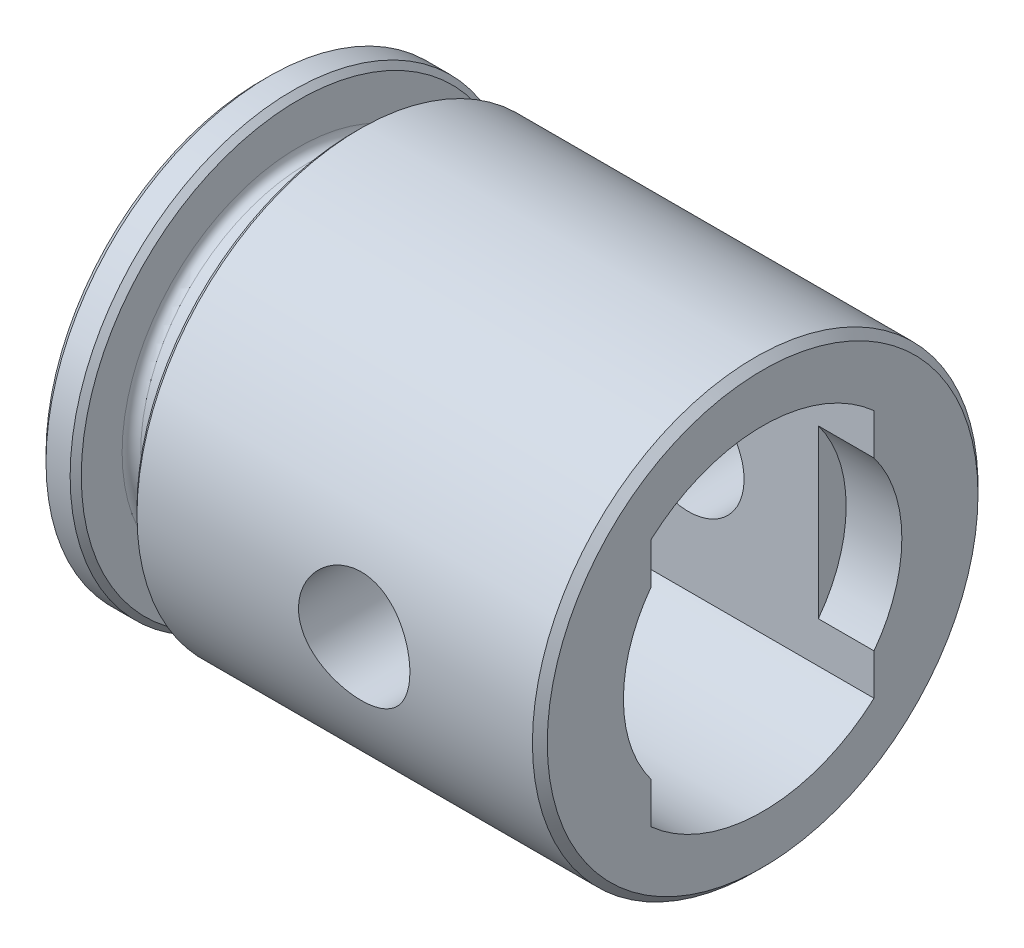
ISO-10303-21;
HEADER;
FILE_DESCRIPTION(('STEP AP214'),'2;1');
FILE_NAME('part.step','',(''),(''),'','','');
FILE_SCHEMA(('AUTOMOTIVE_DESIGN { 1 0 10303 214 1 1 1 1 }'));
ENDSEC;
DATA;
#1=APPLICATION_CONTEXT('core data for automotive mechanical design processes');
#2=APPLICATION_PROTOCOL_DEFINITION('international standard','automotive_design',2000,#1);
#3=PRODUCT_CONTEXT('',#1,'mechanical');
#4=PRODUCT('Part','Part','',(#3));
#5=PRODUCT_RELATED_PRODUCT_CATEGORY('part','',(#4));
#6=PRODUCT_DEFINITION_FORMATION('','',#4);
#7=PRODUCT_DEFINITION_CONTEXT('part definition',#1,'design');
#8=PRODUCT_DEFINITION('design','',#6,#7);
#9=PRODUCT_DEFINITION_SHAPE('','',#8);
#10=(LENGTH_UNIT() NAMED_UNIT(*) SI_UNIT(.MILLI.,.METRE.));
#11=(NAMED_UNIT(*) PLANE_ANGLE_UNIT() SI_UNIT($,.RADIAN.));
#12=(NAMED_UNIT(*) SI_UNIT($,.STERADIAN.) SOLID_ANGLE_UNIT());
#13=UNCERTAINTY_MEASURE_WITH_UNIT(LENGTH_MEASURE(1.E-05),#10,'distance_accuracy_value','');
#14=(GEOMETRIC_REPRESENTATION_CONTEXT(3) GLOBAL_UNCERTAINTY_ASSIGNED_CONTEXT((#13)) GLOBAL_UNIT_ASSIGNED_CONTEXT((#10,
#11,#12)) REPRESENTATION_CONTEXT('',''));
#15=CARTESIAN_POINT('',(0.,0.,0.));
#16=DIRECTION('',(0.,0.,1.));
#17=DIRECTION('',(1.,0.,0.));
#18=AXIS2_PLACEMENT_3D('',#15,#16,#17);
#19=CARTESIAN_POINT('',(-23.48992,0.,0.));
#20=DIRECTION('',(-1.,0.,0.));
#21=DIRECTION('',(0.,0.,1.));
#22=AXIS2_PLACEMENT_3D('',#19,#20,#21);
#23=CYLINDRICAL_SURFACE('',#22,9.);
#24=CARTESIAN_POINT('',(0.,0.,0.));
#25=DIRECTION('',(-1.,0.,0.));
#26=DIRECTION('',(0.,0.,1.));
#27=AXIS2_PLACEMENT_3D('',#24,#25,#26);
#28=CIRCLE('',#27,9.);
#29=CARTESIAN_POINT('',(0.,-6.70820393249937,-6.));
#30=VERTEX_POINT('',#29);
#31=CARTESIAN_POINT('',(0.,-6.70820393249937,6.));
#32=VERTEX_POINT('',#31);
#33=EDGE_CURVE('E451',#30,#32,#28,.T.);
#34=ORIENTED_EDGE('',*,*,#33,.T.);
#35=DIRECTION('',(-1.,0.,0.));
#36=VECTOR('',#35,1.);
#37=CARTESIAN_POINT('',(-23.48992,-6.70820393249937,6.));
#38=LINE('',#37,#36);
#39=CARTESIAN_POINT('',(18.5,-6.70820393249937,6.));
#40=VERTEX_POINT('',#39);
#41=EDGE_CURVE('E505',#32,#40,#38,.F.);
#42=ORIENTED_EDGE('',*,*,#41,.T.);
#43=CARTESIAN_POINT('',(18.5,0.,0.));
#44=DIRECTION('',(-1.,0.,0.));
#45=DIRECTION('',(0.,0.,1.));
#46=AXIS2_PLACEMENT_3D('',#43,#44,#45);
#47=CIRCLE('',#46,9.);
#48=CARTESIAN_POINT('',(18.5,-6.70820393249937,-6.));
#49=VERTEX_POINT('',#48);
#50=EDGE_CURVE('E447',#49,#40,#47,.T.);
#51=ORIENTED_EDGE('',*,*,#50,.F.);
#52=DIRECTION('',(-1.,0.,0.));
#53=VECTOR('',#52,1.);
#54=CARTESIAN_POINT('',(-23.48992,-6.70820393249937,-6.));
#55=LINE('',#54,#53);
#56=EDGE_CURVE('E497',#49,#30,#55,.T.);
#57=ORIENTED_EDGE('',*,*,#56,.T.);
#58=EDGE_LOOP('',(#34,#42,#51,#57));
#59=FACE_BOUND('',#58,.T.);
#60=ADVANCED_FACE('F350',(#59),#23,.F.);
#61=CARTESIAN_POINT('',(18.5,11.6,0.));
#62=DIRECTION('',(-1.,0.,0.));
#63=DIRECTION('',(0.,0.,1.));
#64=AXIS2_PLACEMENT_3D('',#61,#62,#63);
#65=PLANE('',#64);
#66=DIRECTION('',(0.,-1.,0.));
#67=VECTOR('',#66,1.);
#68=CARTESIAN_POINT('',(18.5,6.87680000000009,-6.));
#69=LINE('',#68,#67);
#70=CARTESIAN_POINT('',(18.5,6.70820393249937,-6.));
#71=VERTEX_POINT('',#70);
#72=CARTESIAN_POINT('',(18.5,4.4981939131168,-6.));
#73=VERTEX_POINT('',#72);
#74=EDGE_CURVE('E431',#71,#73,#69,.T.);
#75=ORIENTED_EDGE('',*,*,#74,.T.);
#76=CARTESIAN_POINT('',(18.5,0.,0.));
#77=DIRECTION('',(1.,0.,0.));
#78=DIRECTION('',(0.,0.,-1.));
#79=AXIS2_PLACEMENT_3D('',#76,#77,#78);
#80=CIRCLE('',#79,7.49891648706671);
#81=CARTESIAN_POINT('',(18.5,-4.4981939131168,-6.));
#82=VERTEX_POINT('',#81);
#83=EDGE_CURVE('E414',#82,#73,#80,.T.);
#84=ORIENTED_EDGE('',*,*,#83,.F.);
#85=EDGE_CURVE('E439',#82,#49,#69,.T.);
#86=ORIENTED_EDGE('',*,*,#85,.T.);
#87=ORIENTED_EDGE('',*,*,#50,.T.);
#88=DIRECTION('',(0.,1.,0.));
#89=VECTOR('',#88,1.);
#90=CARTESIAN_POINT('',(18.5,6.87680000000009,6.));
#91=LINE('',#90,#89);
#92=CARTESIAN_POINT('',(18.5,-4.4981939131168,6.));
#93=VERTEX_POINT('',#92);
#94=EDGE_CURVE('E562',#40,#93,#91,.T.);
#95=ORIENTED_EDGE('',*,*,#94,.T.);
#96=CARTESIAN_POINT('',(18.5,4.4981939131168,6.));
#97=VERTEX_POINT('',#96);
#98=EDGE_CURVE('E424',#97,#93,#80,.T.);
#99=ORIENTED_EDGE('',*,*,#98,.F.);
#100=CARTESIAN_POINT('',(18.5,6.70820393249937,6.));
#101=VERTEX_POINT('',#100);
#102=EDGE_CURVE('E563',#97,#101,#91,.T.);
#103=ORIENTED_EDGE('',*,*,#102,.T.);
#104=EDGE_CURVE('E437',#101,#71,#47,.T.);
#105=ORIENTED_EDGE('',*,*,#104,.T.);
#106=EDGE_LOOP('',(#75,#84,#86,#87,#95,#99,#103,#105));
#107=FACE_BOUND('',#106,.T.);
#108=CARTESIAN_POINT('',(18.5,0.,0.));
#109=DIRECTION('',(-1.,0.,0.));
#110=DIRECTION('',(0.,0.,1.));
#111=AXIS2_PLACEMENT_3D('',#108,#109,#110);
#112=CIRCLE('',#111,11.6);
#113=CARTESIAN_POINT('',(18.5,0.,11.6));
#114=VERTEX_POINT('',#113);
#115=EDGE_CURVE('E494',#114,#114,#112,.T.);
#116=ORIENTED_EDGE('',*,*,#115,.F.);
#117=EDGE_LOOP('',(#116));
#118=FACE_BOUND('',#117,.T.);
#119=ADVANCED_FACE('F352',(#107,#118),#65,.F.);
#120=CARTESIAN_POINT('',(18.5,0.,0.));
#121=DIRECTION('',(-1.,0.,0.));
#122=DIRECTION('',(0.,0.,1.));
#123=AXIS2_PLACEMENT_3D('',#120,#121,#122);
#124=CONICAL_SURFACE('',#123,11.6,0.78539816339745);
#125=CARTESIAN_POINT('',(18.1,0.,0.));
#126=DIRECTION('',(-1.,0.,0.));
#127=DIRECTION('',(0.,0.,1.));
#128=AXIS2_PLACEMENT_3D('',#125,#126,#127);
#129=CIRCLE('',#128,12.);
#130=CARTESIAN_POINT('',(18.1,0.,12.));
#131=VERTEX_POINT('',#130);
#132=EDGE_CURVE('E491',#131,#131,#129,.T.);
#133=ORIENTED_EDGE('',*,*,#132,.F.);
#134=EDGE_LOOP('',(#133));
#135=FACE_BOUND('',#134,.T.);
#136=ORIENTED_EDGE('',*,*,#115,.T.);
#137=EDGE_LOOP('',(#136));
#138=FACE_BOUND('',#137,.T.);
#139=ADVANCED_FACE('F543',(#135,#138),#124,.T.);
#140=CARTESIAN_POINT('',(-23.48992,0.,0.));
#141=DIRECTION('',(-1.,0.,0.));
#142=DIRECTION('',(0.,0.,1.));
#143=AXIS2_PLACEMENT_3D('',#140,#141,#142);
#144=CYLINDRICAL_SURFACE('',#143,12.);
#145=CARTESIAN_POINT('',(11.5,0.,12.));
#146=CARTESIAN_POINT('',(11.4999953485237,-0.165752177339462,11.9999971973602));
#147=CARTESIAN_POINT('',(11.4862168984524,-0.331556315661527,11.9965315626365));
#148=CARTESIAN_POINT('',(11.431549697386,-0.658412647541066,11.9830422765979));
#149=CARTESIAN_POINT('',(11.3906455809243,-0.819462093741479,11.9730149083995));
#150=CARTESIAN_POINT('',(11.2831214930758,-1.13204174436515,11.9475125266406));
#151=CARTESIAN_POINT('',(11.2165324025695,-1.28358312686,11.9320440568412));
#152=CARTESIAN_POINT('',(11.0596372199103,-1.57334426380886,11.8973068761524));
#153=CARTESIAN_POINT('',(10.9693303277621,-1.71156356869753,11.8780380370831));
#154=CARTESIAN_POINT('',(10.7655984206916,-1.97360385460183,11.8373482718339));
#155=CARTESIAN_POINT('',(10.6517768500819,-2.09711138012211,11.8158941429625));
#156=CARTESIAN_POINT('',(10.4050955901819,-2.32349785440664,11.7734724023587));
#157=CARTESIAN_POINT('',(10.2722337541061,-2.42637447389838,11.7525048457974));
#158=CARTESIAN_POINT('',(9.98880954652601,-2.61005308559795,11.7130955139634));
#159=CARTESIAN_POINT('',(9.83801353838253,-2.69050443185028,11.6946958892962));
#160=CARTESIAN_POINT('',(9.52450317667992,-2.82479381710149,11.6629898963603));
#161=CARTESIAN_POINT('',(9.36179073333596,-2.87863611088028,11.6496827138884));
#162=CARTESIAN_POINT('',(9.03251300359667,-2.95710967360953,11.6300095339265));
#163=CARTESIAN_POINT('',(8.866090207924,-2.98230453666411,11.6235098199402));
#164=CARTESIAN_POINT('',(8.5312628620013,-3.00452355013282,11.6177872491918));
#165=CARTESIAN_POINT('',(8.36285863861571,-3.00155228363622,11.6185632085586));
#166=CARTESIAN_POINT('',(8.03316838450928,-2.96797304927941,11.6271841103363));
#167=CARTESIAN_POINT('',(7.87180875706933,-2.93803668038127,11.6348572601459));
#168=CARTESIAN_POINT('',(7.55647789817787,-2.85244837380599,11.6561341934214));
#169=CARTESIAN_POINT('',(7.40250719394215,-2.79679460413879,11.6697383993848));
#170=CARTESIAN_POINT('',(7.10452396749573,-2.66077895587437,11.7015022781132));
#171=CARTESIAN_POINT('',(6.96062765642085,-2.58017333446584,11.7197065493963));
#172=CARTESIAN_POINT('',(6.68816258048635,-2.39671255202989,11.7585942169198));
#173=CARTESIAN_POINT('',(6.55959650386549,-2.29385349761767,11.7792780466926));
#174=CARTESIAN_POINT('',(6.31759276861118,-2.06532684936244,11.8215176107978));
#175=CARTESIAN_POINT('',(6.20469101987729,-1.93909251633172,11.84308138956));
#176=CARTESIAN_POINT('',(6.00155751507218,-1.6692238350074,11.8841193115751));
#177=CARTESIAN_POINT('',(5.91132645147286,-1.52558895541589,11.9035933909881));
#178=CARTESIAN_POINT('',(5.75589882755122,-1.22423177736278,11.9383546418838));
#179=CARTESIAN_POINT('',(5.69078931949113,-1.06646278641725,11.9536272025545));
#180=CARTESIAN_POINT('',(5.58816538858084,-0.741752016285765,11.9781583398283));
#181=CARTESIAN_POINT('',(5.55064568716371,-0.57481199830097,11.9874180667856));
#182=CARTESIAN_POINT('',(5.50508486888231,-0.241079940780055,11.9987099854275));
#183=CARTESIAN_POINT('',(5.49631394784938,-0.074393439976422,12.0009210701655));
#184=CARTESIAN_POINT('',(5.50649800411096,0.258065749603015,11.998376096289));
#185=CARTESIAN_POINT('',(5.52545048559826,0.423838519289191,11.9936206648371));
#186=CARTESIAN_POINT('',(5.58994181678274,0.74722853755298,11.977791622547));
#187=CARTESIAN_POINT('',(5.63508252695393,0.904930237937499,11.9668126837158));
#188=CARTESIAN_POINT('',(5.75021416805691,1.21051458490503,11.9397741326831));
#189=CARTESIAN_POINT('',(5.82020760862643,1.3583962380653,11.9237140073996));
#190=CARTESIAN_POINT('',(5.98447225774934,1.64304626885966,11.8878661585244));
#191=CARTESIAN_POINT('',(6.07915222479312,1.77957088367153,11.868017347332));
#192=CARTESIAN_POINT('',(6.28957981759432,2.03505322728662,11.826890183755));
#193=CARTESIAN_POINT('',(6.40533107923528,2.1540079179465,11.8056115850589));
#194=CARTESIAN_POINT('',(6.6580039216874,2.37398113614497,11.76337913919));
#195=CARTESIAN_POINT('',(6.79537540599911,2.47448773524221,11.7424460836496));
#196=CARTESIAN_POINT('',(7.08546526893715,2.65102151802725,11.7038575676408));
#197=CARTESIAN_POINT('',(7.23818296594087,2.72704978832281,11.6862019616993));
#198=CARTESIAN_POINT('',(7.55381144481246,2.85190284121468,11.656361894336));
#199=CARTESIAN_POINT('',(7.71665525662458,2.90088879328717,11.6441451045097));
#200=CARTESIAN_POINT('',(8.04861927571058,2.97069131988587,11.626534880479));
#201=CARTESIAN_POINT('',(8.21773810204289,2.99151405495183,11.6211399540485));
#202=CARTESIAN_POINT('',(8.5522420477232,3.004077180673,11.6178980244194));
#203=CARTESIAN_POINT('',(8.71759487025288,2.99663579556158,11.6198386546564));
#204=CARTESIAN_POINT('',(9.04460777733252,2.95475455662439,11.6305581800657));
#205=CARTESIAN_POINT('',(9.20626793602637,2.92031524537318,11.6393369378128));
#206=CARTESIAN_POINT('',(9.52041691813172,2.82586263888595,11.6626252136787));
#207=CARTESIAN_POINT('',(9.67295461048065,2.76600280936085,11.6771003047327));
#208=CARTESIAN_POINT('',(9.96593076542712,2.62252982721005,11.7101551144901));
#209=CARTESIAN_POINT('',(10.1063675463738,2.53891338006835,11.7287354024137));
#210=CARTESIAN_POINT('',(10.3751092580041,2.3477354972743,11.768512685272));
#211=CARTESIAN_POINT('',(10.5030021468479,2.23960632582452,11.7897652966356));
#212=CARTESIAN_POINT('',(10.7390940895908,2.00357874237947,11.8321605449252));
#213=CARTESIAN_POINT('',(10.8472884602259,1.87567564252229,11.8533031545411));
#214=CARTESIAN_POINT('',(11.0428226171292,1.60093517340518,11.8935531129534));
#215=CARTESIAN_POINT('',(11.1297492273431,1.45379684463277,11.9126166673174));
#216=CARTESIAN_POINT('',(11.277494925881,1.14653211902095,11.9460984995023));
#217=CARTESIAN_POINT('',(11.3383327212971,0.986415126873479,11.9605201039956));
#218=CARTESIAN_POINT('',(11.4231436606593,0.688820506486945,11.9809611913108));
#219=CARTESIAN_POINT('',(11.4519024861069,0.552760341816138,11.9880517010538));
#220=CARTESIAN_POINT('',(11.4903318872439,0.277812143072567,11.997572104639));
#221=CARTESIAN_POINT('',(11.5000038986106,0.138924322485233,12.0000023490179));
#222=CARTESIAN_POINT('',(11.5,0.,12.));
#223=B_SPLINE_CURVE_WITH_KNOTS('',3,(#145,#146,#147,#148,#149,#150,#151,#152,#153,#154,#155,
#156,#157,#158,#159,#160,#161,#162,#163,#164,#165,#166,#167,#168,#169,#170,#171,#172,#173,#174,
#175,#176,#177,#178,#179,#180,#181,#182,#183,#184,#185,#186,#187,#188,#189,#190,#191,#192,#193,
#194,#195,#196,#197,#198,#199,#200,#201,#202,#203,#204,#205,#206,#207,#208,#209,#210,#211,#212,
#213,#214,#215,#216,#217,#218,#219,#220,#221,#222),.UNSPECIFIED.,.T.,.F.,(4,2,2,2,2,2,2,2,2,2,2,
2,2,2,2,2,2,2,2,2,2,2,2,2,2,2,2,2,2,2,2,2,2,2,2,2,2,2,4),(0.,0.49674742494378,0.993776475527799,
1.49020980457221,1.98665988033866,2.49228870874278,2.99797459160124,3.51117295091614,
4.02428922338737,4.5271259020214,5.02988076232035,5.52044994020678,6.01105406938718,
6.506610557544,7.00225381678967,7.5120300194468,8.02182179123136,8.5333645802487,
9.04480947383927,9.54316617905194,10.0414780223213,10.5324054903472,11.0233825465122,
11.5230717513735,12.0228472602268,12.5348901841559,13.0469103750566,13.5558450923716,
14.0646684651657,14.5588756080898,15.0530728192383,15.5443280113065,16.0356513628556,
16.5397915283158,17.0440513955259,17.5574437101093,18.0704672765446,18.4868448589606,
18.9031911209784),.UNSPECIFIED.);
#224=CARTESIAN_POINT('',(11.5,0.,12.));
#225=VERTEX_POINT('',#224);
#226=EDGE_CURVE('E425',#225,#225,#223,.T.);
#227=ORIENTED_EDGE('',*,*,#226,.T.);
#228=EDGE_LOOP('',(#227));
#229=FACE_BOUND('',#228,.T.);
#230=CARTESIAN_POINT('',(11.5,0.,-12.));
#231=CARTESIAN_POINT('',(11.4999953485237,0.165752177339462,-11.9999971973602));
#232=CARTESIAN_POINT('',(11.4862168984524,0.331556315661526,-11.9965315626365));
#233=CARTESIAN_POINT('',(11.431549697386,0.658412647541066,-11.9830422765979));
#234=CARTESIAN_POINT('',(11.3906455809243,0.819462093741479,-11.9730149083995));
#235=CARTESIAN_POINT('',(11.2831214930758,1.13204174436515,-11.9475125266406));
#236=CARTESIAN_POINT('',(11.2165324025695,1.28358312686,-11.9320440568412));
#237=CARTESIAN_POINT('',(11.0596372199103,1.57334426380886,-11.8973068761524));
#238=CARTESIAN_POINT('',(10.9693303277621,1.71156356869753,-11.8780380370831));
#239=CARTESIAN_POINT('',(10.7655984206916,1.97360385460183,-11.8373482718339));
#240=CARTESIAN_POINT('',(10.6517768500819,2.09711138012211,-11.8158941429625));
#241=CARTESIAN_POINT('',(10.4050955901819,2.32349785440664,-11.7734724023587));
#242=CARTESIAN_POINT('',(10.2722337541061,2.42637447389838,-11.7525048457974));
#243=CARTESIAN_POINT('',(9.98880954652601,2.61005308559795,-11.7130955139634));
#244=CARTESIAN_POINT('',(9.83801353838253,2.69050443185028,-11.6946958892962));
#245=CARTESIAN_POINT('',(9.52450317667992,2.82479381710149,-11.6629898963603));
#246=CARTESIAN_POINT('',(9.36179073333596,2.87863611088028,-11.6496827138884));
#247=CARTESIAN_POINT('',(9.03251300359667,2.95710967360953,-11.6300095339265));
#248=CARTESIAN_POINT('',(8.866090207924,2.98230453666411,-11.6235098199402));
#249=CARTESIAN_POINT('',(8.5312628620013,3.00452355013282,-11.6177872491918));
#250=CARTESIAN_POINT('',(8.36285863861571,3.00155228363622,-11.6185632085586));
#251=CARTESIAN_POINT('',(8.03316838450928,2.96797304927941,-11.6271841103363));
#252=CARTESIAN_POINT('',(7.87180875706933,2.93803668038127,-11.6348572601459));
#253=CARTESIAN_POINT('',(7.55647789817787,2.85244837380599,-11.6561341934214));
#254=CARTESIAN_POINT('',(7.40250719394215,2.79679460413879,-11.6697383993848));
#255=CARTESIAN_POINT('',(7.10452396749573,2.66077895587437,-11.7015022781132));
#256=CARTESIAN_POINT('',(6.96062765642085,2.58017333446584,-11.7197065493963));
#257=CARTESIAN_POINT('',(6.68816258048635,2.39671255202989,-11.7585942169198));
#258=CARTESIAN_POINT('',(6.55959650386549,2.29385349761767,-11.7792780466926));
#259=CARTESIAN_POINT('',(6.31759276861118,2.06532684936244,-11.8215176107978));
#260=CARTESIAN_POINT('',(6.20469101987729,1.93909251633172,-11.84308138956));
#261=CARTESIAN_POINT('',(6.00155751507218,1.6692238350074,-11.8841193115751));
#262=CARTESIAN_POINT('',(5.91132645147286,1.52558895541589,-11.9035933909881));
#263=CARTESIAN_POINT('',(5.75589882755122,1.22423177736278,-11.9383546418838));
#264=CARTESIAN_POINT('',(5.69078931949113,1.06646278641725,-11.9536272025545));
#265=CARTESIAN_POINT('',(5.58816538858084,0.741752016285765,-11.9781583398283));
#266=CARTESIAN_POINT('',(5.55064568716371,0.57481199830097,-11.9874180667856));
#267=CARTESIAN_POINT('',(5.50508486888231,0.241079940780055,-11.9987099854275));
#268=CARTESIAN_POINT('',(5.49631394784938,0.074393439976422,-12.0009210701655));
#269=CARTESIAN_POINT('',(5.50649800411096,-0.258065749603015,-11.998376096289));
#270=CARTESIAN_POINT('',(5.52545048559826,-0.423838519289191,-11.9936206648371));
#271=CARTESIAN_POINT('',(5.58994181678274,-0.74722853755298,-11.977791622547));
#272=CARTESIAN_POINT('',(5.63508252695393,-0.904930237937499,-11.9668126837158));
#273=CARTESIAN_POINT('',(5.75021416805691,-1.21051458490503,-11.9397741326831));
#274=CARTESIAN_POINT('',(5.82020760862643,-1.3583962380653,-11.9237140073996));
#275=CARTESIAN_POINT('',(5.98447225774934,-1.64304626885966,-11.8878661585244));
#276=CARTESIAN_POINT('',(6.07915222479312,-1.77957088367153,-11.868017347332));
#277=CARTESIAN_POINT('',(6.28957981759432,-2.03505322728662,-11.826890183755));
#278=CARTESIAN_POINT('',(6.40533107923528,-2.1540079179465,-11.8056115850589));
#279=CARTESIAN_POINT('',(6.6580039216874,-2.37398113614497,-11.76337913919));
#280=CARTESIAN_POINT('',(6.79537540599911,-2.47448773524221,-11.7424460836496));
#281=CARTESIAN_POINT('',(7.08546526893715,-2.65102151802725,-11.7038575676408));
#282=CARTESIAN_POINT('',(7.23818296594087,-2.72704978832281,-11.6862019616993));
#283=CARTESIAN_POINT('',(7.55381144481246,-2.85190284121468,-11.656361894336));
#284=CARTESIAN_POINT('',(7.71665525662458,-2.90088879328717,-11.6441451045097));
#285=CARTESIAN_POINT('',(8.04861927571058,-2.97069131988587,-11.626534880479));
#286=CARTESIAN_POINT('',(8.21773810204289,-2.99151405495183,-11.6211399540485));
#287=CARTESIAN_POINT('',(8.5522420477232,-3.004077180673,-11.6178980244194));
#288=CARTESIAN_POINT('',(8.71759487025288,-2.99663579556158,-11.6198386546564));
#289=CARTESIAN_POINT('',(9.04460777733252,-2.95475455662439,-11.6305581800657));
#290=CARTESIAN_POINT('',(9.20626793602637,-2.92031524537318,-11.6393369378128));
#291=CARTESIAN_POINT('',(9.52041691813172,-2.82586263888595,-11.6626252136787));
#292=CARTESIAN_POINT('',(9.67295461048065,-2.76600280936085,-11.6771003047327));
#293=CARTESIAN_POINT('',(9.96593076542712,-2.62252982721005,-11.7101551144901));
#294=CARTESIAN_POINT('',(10.1063675463738,-2.53891338006835,-11.7287354024137));
#295=CARTESIAN_POINT('',(10.3751092580041,-2.3477354972743,-11.768512685272));
#296=CARTESIAN_POINT('',(10.5030021468479,-2.23960632582452,-11.7897652966356));
#297=CARTESIAN_POINT('',(10.7390940895908,-2.00357874237947,-11.8321605449252));
#298=CARTESIAN_POINT('',(10.8472884602259,-1.87567564252229,-11.8533031545411));
#299=CARTESIAN_POINT('',(11.0428226171292,-1.60093517340518,-11.8935531129534));
#300=CARTESIAN_POINT('',(11.1297492273431,-1.45379684463277,-11.9126166673174));
#301=CARTESIAN_POINT('',(11.277494925881,-1.14653211902095,-11.9460984995023));
#302=CARTESIAN_POINT('',(11.3383327212971,-0.986415126873479,-11.9605201039956));
#303=CARTESIAN_POINT('',(11.4231436606593,-0.688820506486944,-11.9809611913108));
#304=CARTESIAN_POINT('',(11.4519024861069,-0.552760341816138,-11.9880517010538));
#305=CARTESIAN_POINT('',(11.4903318872439,-0.277812143072567,-11.997572104639));
#306=CARTESIAN_POINT('',(11.5000038986106,-0.138924322485233,-12.0000023490179));
#307=CARTESIAN_POINT('',(11.5,0.,-12.));
#308=B_SPLINE_CURVE_WITH_KNOTS('',3,(#230,#231,#232,#233,#234,#235,#236,#237,#238,#239,#240,
#241,#242,#243,#244,#245,#246,#247,#248,#249,#250,#251,#252,#253,#254,#255,#256,#257,#258,#259,
#260,#261,#262,#263,#264,#265,#266,#267,#268,#269,#270,#271,#272,#273,#274,#275,#276,#277,#278,
#279,#280,#281,#282,#283,#284,#285,#286,#287,#288,#289,#290,#291,#292,#293,#294,#295,#296,#297,
#298,#299,#300,#301,#302,#303,#304,#305,#306,#307),.UNSPECIFIED.,.T.,.F.,(4,2,2,2,2,2,2,2,2,2,2,
2,2,2,2,2,2,2,2,2,2,2,2,2,2,2,2,2,2,2,2,2,2,2,2,2,2,2,4),(0.,0.49674742494378,0.993776475527799,
1.49020980457221,1.98665988033866,2.49228870874278,2.99797459160124,3.51117295091614,
4.02428922338737,4.5271259020214,5.02988076232035,5.52044994020678,6.01105406938718,
6.506610557544,7.00225381678967,7.5120300194468,8.02182179123136,8.5333645802487,
9.04480947383927,9.54316617905194,10.0414780223213,10.5324054903472,11.0233825465122,
11.5230717513735,12.0228472602268,12.5348901841559,13.0469103750566,13.5558450923716,
14.0646684651657,14.5588756080898,15.0530728192383,15.5443280113065,16.0356513628556,
16.5397915283158,17.0440513955259,17.5574437101093,18.0704672765446,18.4868448589606,
18.9031911209784),.UNSPECIFIED.);
#309=CARTESIAN_POINT('',(11.5,0.,-12.));
#310=VERTEX_POINT('',#309);
#311=EDGE_CURVE('E573',#310,#310,#308,.T.);
#312=ORIENTED_EDGE('',*,*,#311,.T.);
#313=EDGE_LOOP('',(#312));
#314=FACE_BOUND('',#313,.T.);
#315=CARTESIAN_POINT('',(-3.20000000000001,0.,0.));
#316=DIRECTION('',(-1.,0.,0.));
#317=DIRECTION('',(0.,0.,1.));
#318=AXIS2_PLACEMENT_3D('',#315,#316,#317);
#319=CIRCLE('',#318,12.);
#320=CARTESIAN_POINT('',(-3.20000000000001,0.,12.));
#321=VERTEX_POINT('',#320);
#322=EDGE_CURVE('E488',#321,#321,#319,.T.);
#323=ORIENTED_EDGE('',*,*,#322,.F.);
#324=EDGE_LOOP('',(#323));
#325=FACE_BOUND('',#324,.T.);
#326=ORIENTED_EDGE('',*,*,#132,.T.);
#327=EDGE_LOOP('',(#326));
#328=FACE_BOUND('',#327,.T.);
#329=ADVANCED_FACE('F577',(#229,#314,#325,#328),#144,.T.);
#330=CARTESIAN_POINT('',(-3.20000000000001,0.,0.));
#331=DIRECTION('',(1.,0.,0.));
#332=DIRECTION('',(0.,0.,-1.));
#333=AXIS2_PLACEMENT_3D('',#330,#331,#332);
#334=CONICAL_SURFACE('',#333,12.,0.785398163397451);
#335=CARTESIAN_POINT('',(-3.50000000000001,0.,0.));
#336=DIRECTION('',(-1.,0.,0.));
#337=DIRECTION('',(0.,0.,1.));
#338=AXIS2_PLACEMENT_3D('',#335,#336,#337);
#339=CIRCLE('',#338,11.7);
#340=CARTESIAN_POINT('',(-3.50000000000001,0.,11.7));
#341=VERTEX_POINT('',#340);
#342=EDGE_CURVE('E485',#341,#341,#339,.T.);
#343=ORIENTED_EDGE('',*,*,#342,.F.);
#344=EDGE_LOOP('',(#343));
#345=FACE_BOUND('',#344,.T.);
#346=ORIENTED_EDGE('',*,*,#322,.T.);
#347=EDGE_LOOP('',(#346));
#348=FACE_BOUND('',#347,.T.);
#349=ADVANCED_FACE('F596',(#345,#348),#334,.T.);
#350=CARTESIAN_POINT('',(-3.50000000000001,11.7,0.));
#351=DIRECTION('',(1.,0.,0.));
#352=DIRECTION('',(0.,0.,-1.));
#353=AXIS2_PLACEMENT_3D('',#350,#351,#352);
#354=PLANE('',#353);
#355=CARTESIAN_POINT('',(-3.50000000000001,0.,0.));
#356=DIRECTION('',(-1.,0.,0.));
#357=DIRECTION('',(0.,0.,1.));
#358=AXIS2_PLACEMENT_3D('',#355,#356,#357);
#359=CIRCLE('',#358,9.5);
#360=CARTESIAN_POINT('',(-3.50000000000001,0.,9.5));
#361=VERTEX_POINT('',#360);
#362=EDGE_CURVE('E482',#361,#361,#359,.T.);
#363=ORIENTED_EDGE('',*,*,#362,.F.);
#364=EDGE_LOOP('',(#363));
#365=FACE_BOUND('',#364,.T.);
#366=ORIENTED_EDGE('',*,*,#342,.T.);
#367=EDGE_LOOP('',(#366));
#368=FACE_BOUND('',#367,.T.);
#369=ADVANCED_FACE('F617',(#365,#368),#354,.F.);
#370=CARTESIAN_POINT('',(-4.00000000000001,0.,0.));
#371=DIRECTION('',(-1.,0.,0.));
#372=DIRECTION('',(0.,0.,1.));
#373=AXIS2_PLACEMENT_3D('',#370,#371,#372);
#374=TOROIDAL_SURFACE('',#373,9.5,0.5);
#375=CARTESIAN_POINT('',(-4.00000000000001,0.,0.));
#376=DIRECTION('',(-1.,0.,0.));
#377=DIRECTION('',(0.,0.,1.));
#378=AXIS2_PLACEMENT_3D('',#375,#376,#377);
#379=CIRCLE('',#378,9.);
#380=CARTESIAN_POINT('',(-4.00000000000001,0.,9.));
#381=VERTEX_POINT('',#380);
#382=EDGE_CURVE('E479',#381,#381,#379,.T.);
#383=ORIENTED_EDGE('',*,*,#382,.F.);
#384=EDGE_LOOP('',(#383));
#385=FACE_BOUND('',#384,.T.);
#386=ORIENTED_EDGE('',*,*,#362,.T.);
#387=EDGE_LOOP('',(#386));
#388=FACE_BOUND('',#387,.T.);
#389=ADVANCED_FACE('F624',(#385,#388),#374,.F.);
#390=CARTESIAN_POINT('',(-23.48992,0.,0.));
#391=DIRECTION('',(-1.,0.,0.));
#392=DIRECTION('',(0.,0.,1.));
#393=AXIS2_PLACEMENT_3D('',#390,#391,#392);
#394=CYLINDRICAL_SURFACE('',#393,9.);
#395=CARTESIAN_POINT('',(-6.,0.,0.));
#396=DIRECTION('',(-1.,0.,0.));
#397=DIRECTION('',(0.,0.,1.));
#398=AXIS2_PLACEMENT_3D('',#395,#396,#397);
#399=CIRCLE('',#398,9.);
#400=CARTESIAN_POINT('',(-6.,0.,9.));
#401=VERTEX_POINT('',#400);
#402=EDGE_CURVE('E476',#401,#401,#399,.T.);
#403=ORIENTED_EDGE('',*,*,#402,.F.);
#404=EDGE_LOOP('',(#403));
#405=FACE_BOUND('',#404,.T.);
#406=ORIENTED_EDGE('',*,*,#382,.T.);
#407=EDGE_LOOP('',(#406));
#408=FACE_BOUND('',#407,.T.);
#409=ADVANCED_FACE('F632',(#405,#408),#394,.T.);
#410=CARTESIAN_POINT('',(-6.00000000000001,0.,0.));
#411=DIRECTION('',(-1.,0.,0.));
#412=DIRECTION('',(0.,0.,1.));
#413=AXIS2_PLACEMENT_3D('',#410,#411,#412);
#414=TOROIDAL_SURFACE('',#413,9.5,0.5);
#415=CARTESIAN_POINT('',(-6.50000000000001,0.,0.));
#416=DIRECTION('',(-1.,0.,0.));
#417=DIRECTION('',(0.,0.,1.));
#418=AXIS2_PLACEMENT_3D('',#415,#416,#417);
#419=CIRCLE('',#418,9.5);
#420=CARTESIAN_POINT('',(-6.50000000000001,0.,9.5));
#421=VERTEX_POINT('',#420);
#422=EDGE_CURVE('E473',#421,#421,#419,.T.);
#423=ORIENTED_EDGE('',*,*,#422,.F.);
#424=EDGE_LOOP('',(#423));
#425=FACE_BOUND('',#424,.T.);
#426=ORIENTED_EDGE('',*,*,#402,.T.);
#427=EDGE_LOOP('',(#426));
#428=FACE_BOUND('',#427,.T.);
#429=ADVANCED_FACE('F640',(#425,#428),#414,.F.);
#430=CARTESIAN_POINT('',(-6.50000000000001,11.7,0.));
#431=DIRECTION('',(-1.,0.,0.));
#432=DIRECTION('',(0.,0.,1.));
#433=AXIS2_PLACEMENT_3D('',#430,#431,#432);
#434=PLANE('',#433);
#435=CARTESIAN_POINT('',(-6.50000000000001,0.,0.));
#436=DIRECTION('',(-1.,0.,0.));
#437=DIRECTION('',(0.,0.,1.));
#438=AXIS2_PLACEMENT_3D('',#435,#436,#437);
#439=CIRCLE('',#438,11.7);
#440=CARTESIAN_POINT('',(-6.50000000000001,0.,11.7));
#441=VERTEX_POINT('',#440);
#442=EDGE_CURVE('E470',#441,#441,#439,.T.);
#443=ORIENTED_EDGE('',*,*,#442,.F.);
#444=EDGE_LOOP('',(#443));
#445=FACE_BOUND('',#444,.T.);
#446=ORIENTED_EDGE('',*,*,#422,.T.);
#447=EDGE_LOOP('',(#446));
#448=FACE_BOUND('',#447,.T.);
#449=ADVANCED_FACE('F648',(#445,#448),#434,.F.);
#450=CARTESIAN_POINT('',(-6.50000000000001,0.,0.));
#451=DIRECTION('',(-1.,0.,0.));
#452=DIRECTION('',(0.,0.,1.));
#453=AXIS2_PLACEMENT_3D('',#450,#451,#452);
#454=CONICAL_SURFACE('',#453,11.7,0.785398163397445);
#455=CARTESIAN_POINT('',(-6.80000000000001,0.,0.));
#456=DIRECTION('',(-1.,0.,0.));
#457=DIRECTION('',(0.,0.,1.));
#458=AXIS2_PLACEMENT_3D('',#455,#456,#457);
#459=CIRCLE('',#458,12.);
#460=CARTESIAN_POINT('',(-6.80000000000001,0.,12.));
#461=VERTEX_POINT('',#460);
#462=EDGE_CURVE('E467',#461,#461,#459,.T.);
#463=ORIENTED_EDGE('',*,*,#462,.F.);
#464=EDGE_LOOP('',(#463));
#465=FACE_BOUND('',#464,.T.);
#466=ORIENTED_EDGE('',*,*,#442,.T.);
#467=EDGE_LOOP('',(#466));
#468=FACE_BOUND('',#467,.T.);
#469=ADVANCED_FACE('F656',(#465,#468),#454,.T.);
#470=CARTESIAN_POINT('',(-23.48992,0.,0.));
#471=DIRECTION('',(-1.,0.,0.));
#472=DIRECTION('',(0.,0.,1.));
#473=AXIS2_PLACEMENT_3D('',#470,#471,#472);
#474=CYLINDRICAL_SURFACE('',#473,12.);
#475=CARTESIAN_POINT('',(-8.10000000000001,0.,0.));
#476=DIRECTION('',(-1.,0.,0.));
#477=DIRECTION('',(0.,0.,1.));
#478=AXIS2_PLACEMENT_3D('',#475,#476,#477);
#479=CIRCLE('',#478,12.);
#480=CARTESIAN_POINT('',(-8.10000000000001,0.,12.));
#481=VERTEX_POINT('',#480);
#482=EDGE_CURVE('E464',#481,#481,#479,.T.);
#483=ORIENTED_EDGE('',*,*,#482,.F.);
#484=EDGE_LOOP('',(#483));
#485=FACE_BOUND('',#484,.T.);
#486=ORIENTED_EDGE('',*,*,#462,.T.);
#487=EDGE_LOOP('',(#486));
#488=FACE_BOUND('',#487,.T.);
#489=ADVANCED_FACE('F664',(#485,#488),#474,.T.);
#490=CARTESIAN_POINT('',(-8.10000000000001,0.,0.));
#491=DIRECTION('',(1.,0.,0.));
#492=DIRECTION('',(0.,0.,-1.));
#493=AXIS2_PLACEMENT_3D('',#490,#491,#492);
#494=CONICAL_SURFACE('',#493,12.,0.785398163397448);
#495=CARTESIAN_POINT('',(-8.50000000000001,0.,0.));
#496=DIRECTION('',(-1.,0.,0.));
#497=DIRECTION('',(0.,0.,1.));
#498=AXIS2_PLACEMENT_3D('',#495,#496,#497);
#499=CIRCLE('',#498,11.6);
#500=CARTESIAN_POINT('',(-8.50000000000001,0.,11.6));
#501=VERTEX_POINT('',#500);
#502=EDGE_CURVE('E460',#501,#501,#499,.T.);
#503=ORIENTED_EDGE('',*,*,#502,.F.);
#504=EDGE_LOOP('',(#503));
#505=FACE_BOUND('',#504,.T.);
#506=ORIENTED_EDGE('',*,*,#482,.T.);
#507=EDGE_LOOP('',(#506));
#508=FACE_BOUND('',#507,.T.);
#509=ADVANCED_FACE('F672',(#505,#508),#494,.T.);
#510=CARTESIAN_POINT('',(-8.50000000000001,11.6,0.));
#511=DIRECTION('',(1.,0.,0.));
#512=DIRECTION('',(0.,0.,-1.));
#513=AXIS2_PLACEMENT_3D('',#510,#511,#512);
#514=PLANE('',#513);
#515=ORIENTED_EDGE('',*,*,#502,.T.);
#516=EDGE_LOOP('',(#515));
#517=FACE_BOUND('',#516,.T.);
#518=ADVANCED_FACE('F680',(#517),#514,.F.);
#519=CARTESIAN_POINT('',(0.,0.,0.));
#520=DIRECTION('',(-1.,0.,0.));
#521=DIRECTION('',(0.,1.,0.));
#522=AXIS2_PLACEMENT_3D('',#519,#520,#521);
#523=SPHERICAL_SURFACE('',#522,2.35297157197118);
#524=CARTESIAN_POINT('',(-2.12677397039398,0.,0.));
#525=DIRECTION('',(-1.,0.,0.));
#526=DIRECTION('',(0.,0.,1.));
#527=AXIS2_PLACEMENT_3D('',#524,#525,#526);
#528=CIRCLE('',#527,1.00663185790991);
#529=CARTESIAN_POINT('',(-2.12677397039398,0.,-1.00663185790991));
#530=VERTEX_POINT('',#529);
#531=EDGE_CURVE('E457',#530,#530,#528,.T.);
#532=ORIENTED_EDGE('',*,*,#531,.F.);
#533=EDGE_LOOP('',(#532));
#534=FACE_BOUND('',#533,.T.);
#535=ADVANCED_FACE('F689',(#534),#523,.F.);
#536=CARTESIAN_POINT('',(-2.12677397039398,0.,0.));
#537=DIRECTION('',(1.,0.,0.));
#538=DIRECTION('',(0.,0.,-1.));
#539=AXIS2_PLACEMENT_3D('',#536,#537,#538);
#540=CONICAL_SURFACE('',#539,1.00663185790991,1.12872452789439);
#541=CARTESIAN_POINT('',(0.,0.,0.));
#542=DIRECTION('',(-1.,0.,0.));
#543=DIRECTION('',(0.,0.,1.));
#544=AXIS2_PLACEMENT_3D('',#541,#542,#543);
#545=CIRCLE('',#544,5.5);
#546=CARTESIAN_POINT('',(0.,0.,-5.5));
#547=VERTEX_POINT('',#546);
#548=EDGE_CURVE('E454',#547,#547,#545,.T.);
#549=CARTESIAN_POINT('',(0.,0.,-5.5));
#550=CARTESIAN_POINT('',(-0.0221538955249407,0.,-5.45319408185323));
#551=CARTESIAN_POINT('',(-0.0443077910498779,0.,-5.40638816370646));
#552=CARTESIAN_POINT('',(-0.0886155820997523,0.,-5.31277632741291));
#553=CARTESIAN_POINT('',(-0.110769477624689,0.,-5.26597040926614));
#554=CARTESIAN_POINT('',(-0.155077268674564,0.,-5.1723585729726));
#555=CARTESIAN_POINT('',(-0.177231164199501,0.,-5.12555265482583));
#556=CARTESIAN_POINT('',(-0.221538955249376,0.,-5.03194081853228));
#557=CARTESIAN_POINT('',(-0.243692850774313,0.,-4.98513490038551));
#558=CARTESIAN_POINT('',(-0.288000641824188,0.,-4.89152306409197));
#559=CARTESIAN_POINT('',(-0.310154537349125,0.,-4.8447171459452));
#560=CARTESIAN_POINT('',(-0.354462328398999,0.,-4.75110530965165));
#561=CARTESIAN_POINT('',(-0.376616223923936,0.,-4.70429939150488));
#562=CARTESIAN_POINT('',(-0.420924014973811,0.,-4.61068755521134));
#563=CARTESIAN_POINT('',(-0.443077910498748,0.,-4.56388163706457));
#564=CARTESIAN_POINT('',(-0.487385701548623,0.,-4.47026980077102));
#565=CARTESIAN_POINT('',(-0.50953959707356,0.,-4.42346388262425));
#566=CARTESIAN_POINT('',(-0.553847388123435,0.,-4.32985204633071));
#567=CARTESIAN_POINT('',(-0.576001283648372,0.,-4.28304612818394));
#568=CARTESIAN_POINT('',(-0.620309074698246,0.,-4.18943429189039));
#569=CARTESIAN_POINT('',(-0.642462970223183,0.,-4.14262837374362));
#570=CARTESIAN_POINT('',(-0.686770761273058,0.,-4.04901653745008));
#571=CARTESIAN_POINT('',(-0.708924656797995,0.,-4.00221061930331));
#572=CARTESIAN_POINT('',(-0.75323244784787,0.,-3.90859878300976));
#573=CARTESIAN_POINT('',(-0.775386343372807,0.,-3.86179286486299));
#574=CARTESIAN_POINT('',(-0.819694134422681,0.,-3.76818102856945));
#575=CARTESIAN_POINT('',(-0.841848029947619,0.,-3.72137511042268));
#576=CARTESIAN_POINT('',(-0.886155820997493,0.,-3.62776327412913));
#577=CARTESIAN_POINT('',(-0.90830971652243,0.,-3.58095735598236));
#578=CARTESIAN_POINT('',(-0.952617507572305,0.,-3.48734551968882));
#579=CARTESIAN_POINT('',(-0.974771403097242,0.,-3.44053960154204));
#580=CARTESIAN_POINT('',(-1.01907919414712,0.,-3.3469277652485));
#581=CARTESIAN_POINT('',(-1.04123308967205,0.,-3.30012184710173));
#582=CARTESIAN_POINT('',(-1.08554088072193,0.,-3.20651001080819));
#583=CARTESIAN_POINT('',(-1.10769477624687,0.,-3.15970409266142));
#584=CARTESIAN_POINT('',(-1.15200256729674,0.,-3.06609225636787));
#585=CARTESIAN_POINT('',(-1.17415646282168,0.,-3.0192863382211));
#586=CARTESIAN_POINT('',(-1.21846425387155,0.,-2.92567450192756));
#587=CARTESIAN_POINT('',(-1.24061814939649,0.,-2.87886858378078));
#588=CARTESIAN_POINT('',(-1.28492594044636,0.,-2.78525674748724));
#589=CARTESIAN_POINT('',(-1.3070798359713,0.,-2.73845082934047));
#590=CARTESIAN_POINT('',(-1.35138762702118,0.,-2.64483899304693));
#591=CARTESIAN_POINT('',(-1.37354152254611,0.,-2.59803307490015));
#592=CARTESIAN_POINT('',(-1.41784931359599,0.,-2.50442123860661));
#593=CARTESIAN_POINT('',(-1.44000320912092,0.,-2.45761532045984));
#594=CARTESIAN_POINT('',(-1.4843110001708,0.,-2.36400348416629));
#595=CARTESIAN_POINT('',(-1.50646489569574,0.,-2.31719756601952));
#596=CARTESIAN_POINT('',(-1.55077268674561,0.,-2.22358572972598));
#597=CARTESIAN_POINT('',(-1.57292658227055,0.,-2.17677981157921));
#598=CARTESIAN_POINT('',(-1.61723437332042,0.,-2.08316797528567));
#599=CARTESIAN_POINT('',(-1.63938826884536,0.,-2.03636205713889));
#600=CARTESIAN_POINT('',(-1.68369605989523,0.,-1.94275022084535));
#601=CARTESIAN_POINT('',(-1.70584995542017,0.,-1.89594430269858));
#602=CARTESIAN_POINT('',(-1.75015774647005,0.,-1.80233246640503));
#603=CARTESIAN_POINT('',(-1.77231164199498,0.,-1.75552654825826));
#604=CARTESIAN_POINT('',(-1.81661943304486,0.,-1.66191471196472));
#605=CARTESIAN_POINT('',(-1.83877332856979,0.,-1.61510879381795));
#606=CARTESIAN_POINT('',(-1.88308111961967,0.,-1.5214969575244));
#607=CARTESIAN_POINT('',(-1.90523501514461,0.,-1.47469103937763));
#608=CARTESIAN_POINT('',(-1.94954280619448,0.,-1.38107920308409));
#609=CARTESIAN_POINT('',(-1.97169670171942,0.,-1.33427328493732));
#610=CARTESIAN_POINT('',(-2.01600449276929,0.,-1.24066144864377));
#611=CARTESIAN_POINT('',(-2.03815838829423,0.,-1.193855530497));
#612=CARTESIAN_POINT('',(-2.0824661793441,0.,-1.10024369420346));
#613=CARTESIAN_POINT('',(-2.10462007486904,0.,-1.05343777605669));
#614=CARTESIAN_POINT('',(-2.12677397039398,0.,-1.00663185790991));
#615=B_SPLINE_CURVE_WITH_KNOTS('',3,(#549,#550,#551,#552,#553,#554,#555,#556,#557,#558,#559,
#560,#561,#562,#563,#564,#565,#566,#567,#568,#569,#570,#571,#572,#573,#574,#575,#576,#577,#578,
#579,#580,#581,#582,#583,#584,#585,#586,#587,#588,#589,#590,#591,#592,#593,#594,#595,#596,#597,
#598,#599,#600,#601,#602,#603,#604,#605,#606,#607,#608,#609,#610,#611,#612,#613,#614),
.UNSPECIFIED.,.F.,.F.,(4,2,2,2,2,2,2,2,2,2,2,2,2,2,2,2,2,2,2,2,2,2,2,2,2,2,2,2,2,2,2,2,4),(0.,
0.155352185515458,0.310704371030915,0.466056556546373,0.621408742061831,0.776760927577288,
0.932113113092746,1.0874652986082,1.24281748412366,1.39816966963912,1.55352185515458,
1.70887404067003,1.86422622618549,2.01957841170095,2.17493059721641,2.33028278273187,
2.48563496824732,2.64098715376278,2.79633933927824,2.9516915247937,3.10704371030915,
3.26239589582461,3.41774808134007,3.57310026685553,3.72845245237098,3.88380463788644,
4.0391568234019,4.19450900891736,4.34986119443281,4.50521337994827,4.66056556546373,
4.81591775097919,4.97126993649464),.UNSPECIFIED.);
#616=EDGE_CURVE('BSEAM553',#547,#530,#615,.T.);
#617=ORIENTED_EDGE('',*,*,#548,.F.);
#618=ORIENTED_EDGE('',*,*,#531,.T.);
#619=ORIENTED_EDGE('',*,*,#616,.T.);
#620=ORIENTED_EDGE('',*,*,#616,.F.);
#621=EDGE_LOOP('',(#617,#619,#618,#620));
#622=FACE_BOUND('',#621,.T.);
#623=ADVANCED_FACE('F553',(#622),#540,.F.);
#624=CARTESIAN_POINT('',(0.,9.,0.));
#625=DIRECTION('',(-1.,0.,0.));
#626=DIRECTION('',(0.,0.,1.));
#627=AXIS2_PLACEMENT_3D('',#624,#625,#626);
#628=PLANE('',#627);
#629=CARTESIAN_POINT('',(0.,6.70820393249937,6.));
#630=VERTEX_POINT('',#629);
#631=CARTESIAN_POINT('',(0.,6.70820393249937,-6.));
#632=VERTEX_POINT('',#631);
#633=EDGE_CURVE('E450',#630,#632,#28,.T.);
#634=ORIENTED_EDGE('',*,*,#633,.F.);
#635=DIRECTION('',(0.,-1.,0.));
#636=VECTOR('',#635,1.);
#637=CARTESIAN_POINT('',(0.,9.,6.));
#638=LINE('',#637,#636);
#639=EDGE_CURVE('E443',#630,#32,#638,.T.);
#640=ORIENTED_EDGE('',*,*,#639,.T.);
#641=ORIENTED_EDGE('',*,*,#33,.F.);
#642=DIRECTION('',(0.,1.,0.));
#643=VECTOR('',#642,1.);
#644=CARTESIAN_POINT('',(0.,9.,-6.));
#645=LINE('',#644,#643);
#646=EDGE_CURVE('E438',#30,#632,#645,.T.);
#647=ORIENTED_EDGE('',*,*,#646,.T.);
#648=EDGE_LOOP('',(#634,#640,#641,#647));
#649=FACE_BOUND('',#648,.T.);
#650=ORIENTED_EDGE('',*,*,#548,.T.);
#651=EDGE_LOOP('',(#650));
#652=FACE_BOUND('',#651,.T.);
#653=ADVANCED_FACE('F547',(#649,#652),#628,.F.);
#654=ORIENTED_EDGE('',*,*,#104,.F.);
#655=DIRECTION('',(-1.,0.,0.));
#656=VECTOR('',#655,1.);
#657=CARTESIAN_POINT('',(-23.48992,6.70820393249937,6.));
#658=LINE('',#657,#656);
#659=EDGE_CURVE('E502',#101,#630,#658,.T.);
#660=ORIENTED_EDGE('',*,*,#659,.T.);
#661=ORIENTED_EDGE('',*,*,#633,.T.);
#662=DIRECTION('',(-1.,0.,0.));
#663=VECTOR('',#662,1.);
#664=CARTESIAN_POINT('',(-23.48992,6.70820393249937,-6.));
#665=LINE('',#664,#663);
#666=EDGE_CURVE('E500',#632,#71,#665,.F.);
#667=ORIENTED_EDGE('',*,*,#666,.T.);
#668=EDGE_LOOP('',(#654,#660,#661,#667));
#669=FACE_BOUND('',#668,.T.);
#670=ADVANCED_FACE('F538',(#669),#23,.F.);
#671=CARTESIAN_POINT('',(-1.50000000000001,6.87680000000009,-6.));
#672=DIRECTION('',(0.,0.,1.));
#673=DIRECTION('',(1.,0.,0.));
#674=AXIS2_PLACEMENT_3D('',#671,#672,#673);
#675=PLANE('',#674);
#676=CARTESIAN_POINT('',(8.49999999999999,0.,-6.));
#677=DIRECTION('',(0.,0.,1.));
#678=DIRECTION('',(1.,0.,0.));
#679=AXIS2_PLACEMENT_3D('',#676,#677,#678);
#680=CIRCLE('',#679,3.);
#681=CARTESIAN_POINT('',(11.5,0.,-6.));
#682=VERTEX_POINT('',#681);
#683=EDGE_CURVE('E780',#682,#682,#680,.T.);
#684=ORIENTED_EDGE('',*,*,#683,.F.);
#685=EDGE_LOOP('',(#684));
#686=FACE_BOUND('',#685,.T.);
#687=DIRECTION('',(1.,0.,0.));
#688=VECTOR('',#687,1.);
#689=CARTESIAN_POINT('',(15.5,-4.4981939131168,-6.));
#690=LINE('',#689,#688);
#691=CARTESIAN_POINT('',(15.5,-4.4981939131168,-6.));
#692=VERTEX_POINT('',#691);
#693=EDGE_CURVE('E420',#692,#82,#690,.T.);
#694=ORIENTED_EDGE('',*,*,#693,.F.);
#695=DIRECTION('',(0.,1.,0.));
#696=VECTOR('',#695,1.);
#697=CARTESIAN_POINT('',(15.5,6.87680000000009,-6.));
#698=LINE('',#697,#696);
#699=CARTESIAN_POINT('',(15.5,4.4981939131168,-6.));
#700=VERTEX_POINT('',#699);
#701=EDGE_CURVE('E433',#692,#700,#698,.T.);
#702=ORIENTED_EDGE('',*,*,#701,.T.);
#703=DIRECTION('',(1.,0.,0.));
#704=VECTOR('',#703,1.);
#705=CARTESIAN_POINT('',(15.5,4.4981939131168,-6.));
#706=LINE('',#705,#704);
#707=EDGE_CURVE('E417',#73,#700,#706,.F.);
#708=ORIENTED_EDGE('',*,*,#707,.F.);
#709=ORIENTED_EDGE('',*,*,#74,.F.);
#710=ORIENTED_EDGE('',*,*,#666,.F.);
#711=ORIENTED_EDGE('',*,*,#646,.F.);
#712=ORIENTED_EDGE('',*,*,#56,.F.);
#713=ORIENTED_EDGE('',*,*,#85,.F.);
#714=EDGE_LOOP('',(#694,#702,#708,#709,#710,#711,#712,#713));
#715=FACE_BOUND('',#714,.T.);
#716=ADVANCED_FACE('F429',(#686,#715),#675,.T.);
#717=CARTESIAN_POINT('',(-1.50000000000001,6.87680000000009,6.));
#718=DIRECTION('',(0.,0.,-1.));
#719=DIRECTION('',(-1.,0.,0.));
#720=AXIS2_PLACEMENT_3D('',#717,#718,#719);
#721=PLANE('',#720);
#722=CARTESIAN_POINT('',(8.49999999999999,0.,6.));
#723=DIRECTION('',(0.,0.,-1.));
#724=DIRECTION('',(-1.,0.,0.));
#725=AXIS2_PLACEMENT_3D('',#722,#723,#724);
#726=CIRCLE('',#725,3.);
#727=CARTESIAN_POINT('',(5.49999999999999,0.,6.));
#728=VERTEX_POINT('',#727);
#729=EDGE_CURVE('E354',#728,#728,#726,.T.);
#730=ORIENTED_EDGE('',*,*,#729,.F.);
#731=EDGE_LOOP('',(#730));
#732=FACE_BOUND('',#731,.T.);
#733=DIRECTION('',(1.,0.,0.));
#734=VECTOR('',#733,1.);
#735=CARTESIAN_POINT('',(15.5,4.4981939131168,6.));
#736=LINE('',#735,#734);
#737=CARTESIAN_POINT('',(15.5,4.4981939131168,6.));
#738=VERTEX_POINT('',#737);
#739=EDGE_CURVE('E11',#738,#97,#736,.T.);
#740=ORIENTED_EDGE('',*,*,#739,.F.);
#741=DIRECTION('',(0.,-1.,0.));
#742=VECTOR('',#741,1.);
#743=CARTESIAN_POINT('',(15.5,6.87680000000009,6.));
#744=LINE('',#743,#742);
#745=CARTESIAN_POINT('',(15.5,-4.4981939131168,6.));
#746=VERTEX_POINT('',#745);
#747=EDGE_CURVE('E508',#738,#746,#744,.T.);
#748=ORIENTED_EDGE('',*,*,#747,.T.);
#749=DIRECTION('',(1.,0.,0.));
#750=VECTOR('',#749,1.);
#751=CARTESIAN_POINT('',(15.5,-4.4981939131168,6.));
#752=LINE('',#751,#750);
#753=EDGE_CURVE('E359',#93,#746,#752,.F.);
#754=ORIENTED_EDGE('',*,*,#753,.F.);
#755=ORIENTED_EDGE('',*,*,#94,.F.);
#756=ORIENTED_EDGE('',*,*,#41,.F.);
#757=ORIENTED_EDGE('',*,*,#639,.F.);
#758=ORIENTED_EDGE('',*,*,#659,.F.);
#759=ORIENTED_EDGE('',*,*,#102,.F.);
#760=EDGE_LOOP('',(#740,#748,#754,#755,#756,#757,#758,#759));
#761=FACE_BOUND('',#760,.T.);
#762=ADVANCED_FACE('F518',(#732,#761),#721,.T.);
#763=CARTESIAN_POINT('',(15.5,0.,0.));
#764=DIRECTION('',(1.,0.,0.));
#765=DIRECTION('',(0.,0.,-1.));
#766=AXIS2_PLACEMENT_3D('',#763,#764,#765);
#767=PLANE('',#766);
#768=CARTESIAN_POINT('',(15.5,0.,0.));
#769=DIRECTION('',(1.,0.,0.));
#770=DIRECTION('',(0.,0.,-1.));
#771=AXIS2_PLACEMENT_3D('',#768,#769,#770);
#772=CIRCLE('',#771,7.49891648706671);
#773=EDGE_CURVE('E372',#738,#746,#772,.T.);
#774=ORIENTED_EDGE('',*,*,#773,.T.);
#775=ORIENTED_EDGE('',*,*,#747,.F.);
#776=EDGE_LOOP('',(#774,#775));
#777=FACE_BOUND('',#776,.T.);
#778=ADVANCED_FACE('F520',(#777),#767,.T.);
#779=CARTESIAN_POINT('',(15.5,0.,0.));
#780=DIRECTION('',(1.,0.,0.));
#781=DIRECTION('',(0.,0.,-1.));
#782=AXIS2_PLACEMENT_3D('',#779,#780,#781);
#783=CYLINDRICAL_SURFACE('',#782,7.49891648706671);
#784=ORIENTED_EDGE('',*,*,#739,.T.);
#785=ORIENTED_EDGE('',*,*,#98,.T.);
#786=ORIENTED_EDGE('',*,*,#753,.T.);
#787=ORIENTED_EDGE('',*,*,#773,.F.);
#788=EDGE_LOOP('',(#784,#785,#786,#787));
#789=FACE_BOUND('',#788,.T.);
#790=ADVANCED_FACE('F513',(#789),#783,.F.);
#791=ORIENTED_EDGE('',*,*,#693,.T.);
#792=ORIENTED_EDGE('',*,*,#83,.T.);
#793=ORIENTED_EDGE('',*,*,#707,.T.);
#794=EDGE_CURVE('E365',#692,#700,#772,.T.);
#795=ORIENTED_EDGE('',*,*,#794,.F.);
#796=EDGE_LOOP('',(#791,#792,#793,#795));
#797=FACE_BOUND('',#796,.T.);
#798=ADVANCED_FACE('F416',(#797),#783,.F.);
#799=ORIENTED_EDGE('',*,*,#794,.T.);
#800=ORIENTED_EDGE('',*,*,#701,.F.);
#801=EDGE_LOOP('',(#799,#800));
#802=FACE_BOUND('',#801,.T.);
#803=ADVANCED_FACE('F523',(#802),#767,.T.);
#804=CARTESIAN_POINT('',(8.49999999999999,0.,-16.5));
#805=DIRECTION('',(0.,0.,1.));
#806=DIRECTION('',(1.,0.,0.));
#807=AXIS2_PLACEMENT_3D('',#804,#805,#806);
#808=CYLINDRICAL_SURFACE('',#807,3.);
#809=ORIENTED_EDGE('',*,*,#729,.T.);
#810=EDGE_LOOP('',(#809));
#811=FACE_BOUND('',#810,.T.);
#812=ORIENTED_EDGE('',*,*,#226,.F.);
#813=EDGE_LOOP('',(#812));
#814=FACE_BOUND('',#813,.T.);
#815=ADVANCED_FACE('F534',(#811,#814),#808,.F.);
#816=ORIENTED_EDGE('',*,*,#683,.T.);
#817=EDGE_LOOP('',(#816));
#818=FACE_BOUND('',#817,.T.);
#819=ORIENTED_EDGE('',*,*,#311,.F.);
#820=EDGE_LOOP('',(#819));
#821=FACE_BOUND('',#820,.T.);
#822=ADVANCED_FACE('F582',(#818,#821),#808,.F.);
#823=CLOSED_SHELL('',(#60,#119,#139,#329,#349,#369,#389,#409,#429,#449,#469,#489,#509,#518,#535,
#623,#653,#670,#716,#762,#778,#790,#798,#803,#815,#822));
#824=MANIFOLD_SOLID_BREP('B2',#823);
#825=ADVANCED_BREP_SHAPE_REPRESENTATION('',(#18,#824),#14);
#826=SHAPE_DEFINITION_REPRESENTATION(#9,#825);
ENDSEC;
END-ISO-10303-21;
